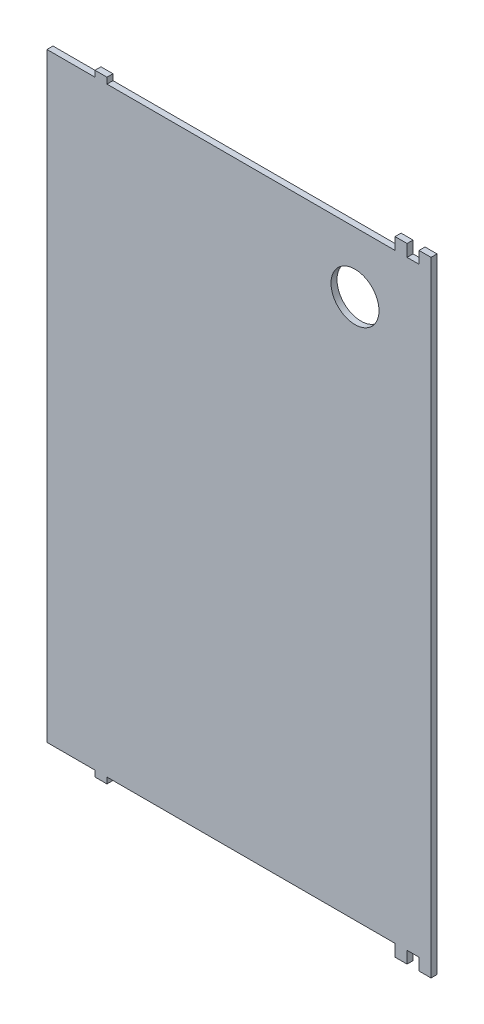
ISO-10303-21;
HEADER;
FILE_DESCRIPTION(('STEP AP214'),'2;1');
FILE_NAME('part.step','',(''),(''),'','','');
FILE_SCHEMA(('AUTOMOTIVE_DESIGN { 1 0 10303 214 1 1 1 1 }'));
ENDSEC;
DATA;
#1=APPLICATION_CONTEXT('core data for automotive mechanical design processes');
#2=APPLICATION_PROTOCOL_DEFINITION('international standard','automotive_design',2000,#1);
#3=PRODUCT_CONTEXT('',#1,'mechanical');
#4=PRODUCT('Part','Part','',(#3));
#5=PRODUCT_RELATED_PRODUCT_CATEGORY('part','',(#4));
#6=PRODUCT_DEFINITION_FORMATION('','',#4);
#7=PRODUCT_DEFINITION_CONTEXT('part definition',#1,'design');
#8=PRODUCT_DEFINITION('design','',#6,#7);
#9=PRODUCT_DEFINITION_SHAPE('','',#8);
#10=(LENGTH_UNIT() NAMED_UNIT(*) SI_UNIT(.MILLI.,.METRE.));
#11=(NAMED_UNIT(*) PLANE_ANGLE_UNIT() SI_UNIT($,.RADIAN.));
#12=(NAMED_UNIT(*) SI_UNIT($,.STERADIAN.) SOLID_ANGLE_UNIT());
#13=UNCERTAINTY_MEASURE_WITH_UNIT(LENGTH_MEASURE(1.E-05),#10,'distance_accuracy_value','');
#14=(GEOMETRIC_REPRESENTATION_CONTEXT(3) GLOBAL_UNCERTAINTY_ASSIGNED_CONTEXT((#13)) GLOBAL_UNIT_ASSIGNED_CONTEXT((#10,
#11,#12)) REPRESENTATION_CONTEXT('',''));
#15=CARTESIAN_POINT('',(0.,0.,0.));
#16=DIRECTION('',(0.,0.,1.));
#17=DIRECTION('',(1.,0.,0.));
#18=AXIS2_PLACEMENT_3D('',#15,#16,#17);
#19=CARTESIAN_POINT('',(0.,0.,2.));
#20=DIRECTION('',(0.,0.,1.));
#21=DIRECTION('',(1.,0.,0.));
#22=AXIS2_PLACEMENT_3D('',#19,#20,#21);
#23=PLANE('',#22);
#24=DIRECTION('',(0.,1.,0.));
#25=VECTOR('',#24,1.);
#26=CARTESIAN_POINT('',(43.6313588850174,146.890104529617,2.));
#27=LINE('',#26,#25);
#28=CARTESIAN_POINT('',(43.6313588850174,-57.1098954703833,2.));
#29=VERTEX_POINT('',#28);
#30=CARTESIAN_POINT('',(43.6313588850174,150.890104529617,2.));
#31=VERTEX_POINT('',#30);
#32=EDGE_CURVE('E52',#29,#31,#27,.T.);
#33=ORIENTED_EDGE('',*,*,#32,.T.);
#34=DIRECTION('',(-1.,0.,0.));
#35=VECTOR('',#34,1.);
#36=CARTESIAN_POINT('',(43.6313588850174,150.890104529617,2.));
#37=LINE('',#36,#35);
#38=CARTESIAN_POINT('',(39.6313588850174,150.890104529617,2.));
#39=VERTEX_POINT('',#38);
#40=EDGE_CURVE('E145',#31,#39,#37,.T.);
#41=ORIENTED_EDGE('',*,*,#40,.T.);
#42=DIRECTION('',(0.,-1.,0.));
#43=VECTOR('',#42,1.);
#44=CARTESIAN_POINT('',(39.6313588850174,150.890104529617,2.));
#45=LINE('',#44,#43);
#46=CARTESIAN_POINT('',(39.6313588850174,146.890104529617,2.));
#47=VERTEX_POINT('',#46);
#48=EDGE_CURVE('E343',#39,#47,#45,.T.);
#49=ORIENTED_EDGE('',*,*,#48,.T.);
#50=DIRECTION('',(-1.,0.,0.));
#51=VECTOR('',#50,1.);
#52=CARTESIAN_POINT('',(39.6313588850174,146.890104529617,2.));
#53=LINE('',#52,#51);
#54=CARTESIAN_POINT('',(35.6313588850173,146.890104529617,2.));
#55=VERTEX_POINT('',#54);
#56=EDGE_CURVE('E360',#47,#55,#53,.T.);
#57=ORIENTED_EDGE('',*,*,#56,.T.);
#58=DIRECTION('',(0.,1.,0.));
#59=VECTOR('',#58,1.);
#60=CARTESIAN_POINT('',(35.6313588850173,146.890104529617,2.));
#61=LINE('',#60,#59);
#62=CARTESIAN_POINT('',(35.6313588850173,150.890104529617,2.));
#63=VERTEX_POINT('',#62);
#64=EDGE_CURVE('E357',#55,#63,#61,.T.);
#65=ORIENTED_EDGE('',*,*,#64,.T.);
#66=DIRECTION('',(-1.,0.,0.));
#67=VECTOR('',#66,1.);
#68=CARTESIAN_POINT('',(35.6313588850173,150.890104529617,2.));
#69=LINE('',#68,#67);
#70=CARTESIAN_POINT('',(31.6313588850173,150.890104529617,2.));
#71=VERTEX_POINT('',#70);
#72=EDGE_CURVE('E359',#63,#71,#69,.T.);
#73=ORIENTED_EDGE('',*,*,#72,.T.);
#74=DIRECTION('',(0.,-1.,0.));
#75=VECTOR('',#74,1.);
#76=CARTESIAN_POINT('',(31.6313588850173,150.890104529617,2.));
#77=LINE('',#76,#75);
#78=CARTESIAN_POINT('',(31.6313588850173,146.890104529617,2.));
#79=VERTEX_POINT('',#78);
#80=EDGE_CURVE('E362',#71,#79,#77,.T.);
#81=ORIENTED_EDGE('',*,*,#80,.T.);
#82=DIRECTION('',(-1.,0.,0.));
#83=VECTOR('',#82,1.);
#84=CARTESIAN_POINT('',(-64.3686411149827,146.890104529617,2.));
#85=LINE('',#84,#83);
#86=CARTESIAN_POINT('',(-64.3686411149827,146.890104529617,2.));
#87=VERTEX_POINT('',#86);
#88=EDGE_CURVE('E368',#79,#87,#85,.T.);
#89=ORIENTED_EDGE('',*,*,#88,.T.);
#90=DIRECTION('',(0.,1.,0.));
#91=VECTOR('',#90,1.);
#92=CARTESIAN_POINT('',(-64.3686411149827,148.890104529617,2.));
#93=LINE('',#92,#91);
#94=CARTESIAN_POINT('',(-64.3686411149827,148.890104529617,2.));
#95=VERTEX_POINT('',#94);
#96=EDGE_CURVE('E370',#87,#95,#93,.T.);
#97=ORIENTED_EDGE('',*,*,#96,.T.);
#98=DIRECTION('',(-1.,0.,0.));
#99=VECTOR('',#98,1.);
#100=CARTESIAN_POINT('',(-66.3686411149827,148.890104529617,2.));
#101=LINE('',#100,#99);
#102=CARTESIAN_POINT('',(-68.3686411149827,148.890104529617,2.));
#103=VERTEX_POINT('',#102);
#104=EDGE_CURVE('E372',#95,#103,#101,.T.);
#105=ORIENTED_EDGE('',*,*,#104,.T.);
#106=DIRECTION('',(0.,-1.,0.));
#107=VECTOR('',#106,1.);
#108=CARTESIAN_POINT('',(-68.3686411149827,148.890104529617,2.));
#109=LINE('',#108,#107);
#110=CARTESIAN_POINT('',(-68.3686411149827,146.890104529617,2.));
#111=VERTEX_POINT('',#110);
#112=EDGE_CURVE('E374',#103,#111,#109,.T.);
#113=ORIENTED_EDGE('',*,*,#112,.T.);
#114=DIRECTION('',(-1.,0.,0.));
#115=VECTOR('',#114,1.);
#116=CARTESIAN_POINT('',(-68.3686411149827,146.890104529617,2.));
#117=LINE('',#116,#115);
#118=CARTESIAN_POINT('',(-84.3686411149826,146.890104529617,2.));
#119=VERTEX_POINT('',#118);
#120=EDGE_CURVE('E376',#111,#119,#117,.T.);
#121=ORIENTED_EDGE('',*,*,#120,.T.);
#122=DIRECTION('',(0.,-1.,0.));
#123=VECTOR('',#122,1.);
#124=CARTESIAN_POINT('',(-84.3686411149826,146.890104529617,2.));
#125=LINE('',#124,#123);
#126=CARTESIAN_POINT('',(-84.3686411149826,-53.1098954703833,2.));
#127=VERTEX_POINT('',#126);
#128=EDGE_CURVE('E378',#119,#127,#125,.T.);
#129=ORIENTED_EDGE('',*,*,#128,.T.);
#130=DIRECTION('',(1.,0.,0.));
#131=VECTOR('',#130,1.);
#132=CARTESIAN_POINT('',(-68.3686411149826,-53.1098954703833,2.));
#133=LINE('',#132,#131);
#134=CARTESIAN_POINT('',(-68.3686411149826,-53.1098954703833,2.));
#135=VERTEX_POINT('',#134);
#136=EDGE_CURVE('E380',#127,#135,#133,.T.);
#137=ORIENTED_EDGE('',*,*,#136,.T.);
#138=DIRECTION('',(0.,-1.,0.));
#139=VECTOR('',#138,1.);
#140=CARTESIAN_POINT('',(-68.3686411149826,-53.1098954703833,2.));
#141=LINE('',#140,#139);
#142=CARTESIAN_POINT('',(-68.3686411149826,-55.1098954703833,2.));
#143=VERTEX_POINT('',#142);
#144=EDGE_CURVE('E382',#135,#143,#141,.T.);
#145=ORIENTED_EDGE('',*,*,#144,.T.);
#146=DIRECTION('',(1.,0.,0.));
#147=VECTOR('',#146,1.);
#148=CARTESIAN_POINT('',(-66.3686411149826,-55.1098954703833,2.));
#149=LINE('',#148,#147);
#150=CARTESIAN_POINT('',(-64.3686411149826,-55.1098954703833,2.));
#151=VERTEX_POINT('',#150);
#152=EDGE_CURVE('E384',#143,#151,#149,.T.);
#153=ORIENTED_EDGE('',*,*,#152,.T.);
#154=DIRECTION('',(0.,1.,0.));
#155=VECTOR('',#154,1.);
#156=CARTESIAN_POINT('',(-64.3686411149826,-55.1098954703833,2.));
#157=LINE('',#156,#155);
#158=CARTESIAN_POINT('',(-64.3686411149826,-53.1098954703833,2.));
#159=VERTEX_POINT('',#158);
#160=EDGE_CURVE('E386',#151,#159,#157,.T.);
#161=ORIENTED_EDGE('',*,*,#160,.T.);
#162=DIRECTION('',(1.,0.,0.));
#163=VECTOR('',#162,1.);
#164=CARTESIAN_POINT('',(-64.3686411149826,-53.1098954703833,2.));
#165=LINE('',#164,#163);
#166=CARTESIAN_POINT('',(31.6313588850174,-53.1098954703833,2.));
#167=VERTEX_POINT('',#166);
#168=EDGE_CURVE('E388',#159,#167,#165,.T.);
#169=ORIENTED_EDGE('',*,*,#168,.T.);
#170=DIRECTION('',(0.,-1.,0.));
#171=VECTOR('',#170,1.);
#172=CARTESIAN_POINT('',(31.6313588850174,-57.1098954703833,2.));
#173=LINE('',#172,#171);
#174=CARTESIAN_POINT('',(31.6313588850174,-57.1098954703833,2.));
#175=VERTEX_POINT('',#174);
#176=EDGE_CURVE('E390',#167,#175,#173,.T.);
#177=ORIENTED_EDGE('',*,*,#176,.T.);
#178=DIRECTION('',(1.,0.,0.));
#179=VECTOR('',#178,1.);
#180=CARTESIAN_POINT('',(35.6313588850174,-57.1098954703833,2.));
#181=LINE('',#180,#179);
#182=CARTESIAN_POINT('',(35.6313588850174,-57.1098954703833,2.));
#183=VERTEX_POINT('',#182);
#184=EDGE_CURVE('E392',#175,#183,#181,.T.);
#185=ORIENTED_EDGE('',*,*,#184,.T.);
#186=DIRECTION('',(0.,1.,0.));
#187=VECTOR('',#186,1.);
#188=CARTESIAN_POINT('',(35.6313588850174,-53.1098954703833,2.));
#189=LINE('',#188,#187);
#190=CARTESIAN_POINT('',(35.6313588850174,-53.1098954703833,2.));
#191=VERTEX_POINT('',#190);
#192=EDGE_CURVE('E213',#183,#191,#189,.T.);
#193=ORIENTED_EDGE('',*,*,#192,.T.);
#194=DIRECTION('',(1.,0.,0.));
#195=VECTOR('',#194,1.);
#196=CARTESIAN_POINT('',(39.6313588850174,-53.1098954703833,2.));
#197=LINE('',#196,#195);
#198=CARTESIAN_POINT('',(39.6313588850174,-53.1098954703833,2.));
#199=VERTEX_POINT('',#198);
#200=EDGE_CURVE('E207',#191,#199,#197,.T.);
#201=ORIENTED_EDGE('',*,*,#200,.T.);
#202=DIRECTION('',(0.,-1.,0.));
#203=VECTOR('',#202,1.);
#204=CARTESIAN_POINT('',(39.6313588850174,-57.1098954703833,2.));
#205=LINE('',#204,#203);
#206=CARTESIAN_POINT('',(39.6313588850174,-57.1098954703833,2.));
#207=VERTEX_POINT('',#206);
#208=EDGE_CURVE('E211',#199,#207,#205,.T.);
#209=ORIENTED_EDGE('',*,*,#208,.T.);
#210=DIRECTION('',(1.,0.,0.));
#211=VECTOR('',#210,1.);
#212=CARTESIAN_POINT('',(43.6313588850174,-57.1098954703833,2.));
#213=LINE('',#212,#211);
#214=EDGE_CURVE('E227',#207,#29,#213,.T.);
#215=ORIENTED_EDGE('',*,*,#214,.T.);
#216=EDGE_LOOP('',(#33,#41,#49,#57,#65,#73,#81,#89,#97,#105,#113,#121,#129,#137,#145,#153,#161,
#169,#177,#185,#193,#201,#209,#215));
#217=FACE_BOUND('',#216,.T.);
#218=CARTESIAN_POINT('',(18.2891681924389,126.803401032248,2.));
#219=DIRECTION('',(0.,0.,1.));
#220=DIRECTION('',(1.,0.,0.));
#221=AXIS2_PLACEMENT_3D('',#218,#219,#220);
#222=CIRCLE('',#221,8.);
#223=CARTESIAN_POINT('',(26.2891681924389,126.803401032248,2.));
#224=VERTEX_POINT('',#223);
#225=EDGE_CURVE('E236',#224,#224,#222,.T.);
#226=ORIENTED_EDGE('',*,*,#225,.F.);
#227=EDGE_LOOP('',(#226));
#228=FACE_BOUND('',#227,.T.);
#229=ADVANCED_FACE('F35',(#217,#228),#23,.T.);
#230=CARTESIAN_POINT('',(0.,0.,0.));
#231=DIRECTION('',(0.,0.,1.));
#232=DIRECTION('',(1.,0.,0.));
#233=AXIS2_PLACEMENT_3D('',#230,#231,#232);
#234=PLANE('',#233);
#235=DIRECTION('',(-1.,0.,0.));
#236=VECTOR('',#235,1.);
#237=CARTESIAN_POINT('',(43.6313588850174,150.890104529617,0.));
#238=LINE('',#237,#236);
#239=CARTESIAN_POINT('',(43.6313588850174,150.890104529617,0.));
#240=VERTEX_POINT('',#239);
#241=CARTESIAN_POINT('',(39.6313588850174,150.890104529617,0.));
#242=VERTEX_POINT('',#241);
#243=EDGE_CURVE('E233',#240,#242,#238,.T.);
#244=ORIENTED_EDGE('',*,*,#243,.F.);
#245=DIRECTION('',(0.,1.,0.));
#246=VECTOR('',#245,1.);
#247=CARTESIAN_POINT('',(43.6313588850174,-53.1098954703833,0.));
#248=LINE('',#247,#246);
#249=CARTESIAN_POINT('',(43.6313588850174,-57.1098954703833,0.));
#250=VERTEX_POINT('',#249);
#251=EDGE_CURVE('E137',#250,#240,#248,.T.);
#252=ORIENTED_EDGE('',*,*,#251,.F.);
#253=DIRECTION('',(1.,0.,0.));
#254=VECTOR('',#253,1.);
#255=CARTESIAN_POINT('',(43.6313588850174,-57.1098954703833,0.));
#256=LINE('',#255,#254);
#257=CARTESIAN_POINT('',(39.6313588850174,-57.1098954703833,0.));
#258=VERTEX_POINT('',#257);
#259=EDGE_CURVE('E278',#258,#250,#256,.T.);
#260=ORIENTED_EDGE('',*,*,#259,.F.);
#261=DIRECTION('',(0.,-1.,0.));
#262=VECTOR('',#261,1.);
#263=CARTESIAN_POINT('',(39.6313588850174,-57.1098954703833,0.));
#264=LINE('',#263,#262);
#265=CARTESIAN_POINT('',(39.6313588850174,-53.1098954703833,0.));
#266=VERTEX_POINT('',#265);
#267=EDGE_CURVE('E130',#266,#258,#264,.T.);
#268=ORIENTED_EDGE('',*,*,#267,.F.);
#269=DIRECTION('',(1.,0.,0.));
#270=VECTOR('',#269,1.);
#271=CARTESIAN_POINT('',(39.6313588850174,-53.1098954703833,0.));
#272=LINE('',#271,#270);
#273=CARTESIAN_POINT('',(35.6313588850174,-53.1098954703833,0.));
#274=VERTEX_POINT('',#273);
#275=EDGE_CURVE('E221',#274,#266,#272,.T.);
#276=ORIENTED_EDGE('',*,*,#275,.F.);
#277=DIRECTION('',(0.,1.,0.));
#278=VECTOR('',#277,1.);
#279=CARTESIAN_POINT('',(35.6313588850174,-53.1098954703833,0.));
#280=LINE('',#279,#278);
#281=CARTESIAN_POINT('',(35.6313588850174,-57.1098954703833,0.));
#282=VERTEX_POINT('',#281);
#283=EDGE_CURVE('E274',#282,#274,#280,.T.);
#284=ORIENTED_EDGE('',*,*,#283,.F.);
#285=DIRECTION('',(1.,0.,0.));
#286=VECTOR('',#285,1.);
#287=CARTESIAN_POINT('',(35.6313588850174,-57.1098954703833,0.));
#288=LINE('',#287,#286);
#289=CARTESIAN_POINT('',(31.6313588850174,-57.1098954703833,0.));
#290=VERTEX_POINT('',#289);
#291=EDGE_CURVE('E272',#290,#282,#288,.T.);
#292=ORIENTED_EDGE('',*,*,#291,.F.);
#293=DIRECTION('',(0.,-1.,0.));
#294=VECTOR('',#293,1.);
#295=CARTESIAN_POINT('',(31.6313588850174,-57.1098954703833,0.));
#296=LINE('',#295,#294);
#297=CARTESIAN_POINT('',(31.6313588850174,-53.1098954703833,0.));
#298=VERTEX_POINT('',#297);
#299=EDGE_CURVE('E270',#298,#290,#296,.T.);
#300=ORIENTED_EDGE('',*,*,#299,.F.);
#301=DIRECTION('',(1.,0.,0.));
#302=VECTOR('',#301,1.);
#303=CARTESIAN_POINT('',(-64.3686411149826,-53.1098954703833,0.));
#304=LINE('',#303,#302);
#305=CARTESIAN_POINT('',(-64.3686411149826,-53.1098954703833,0.));
#306=VERTEX_POINT('',#305);
#307=EDGE_CURVE('E268',#306,#298,#304,.T.);
#308=ORIENTED_EDGE('',*,*,#307,.F.);
#309=DIRECTION('',(0.,1.,0.));
#310=VECTOR('',#309,1.);
#311=CARTESIAN_POINT('',(-64.3686411149826,-55.1098954703833,0.));
#312=LINE('',#311,#310);
#313=CARTESIAN_POINT('',(-64.3686411149826,-55.1098954703833,0.));
#314=VERTEX_POINT('',#313);
#315=EDGE_CURVE('E266',#314,#306,#312,.T.);
#316=ORIENTED_EDGE('',*,*,#315,.F.);
#317=DIRECTION('',(1.,0.,0.));
#318=VECTOR('',#317,1.);
#319=CARTESIAN_POINT('',(-66.3686411149826,-55.1098954703833,0.));
#320=LINE('',#319,#318);
#321=CARTESIAN_POINT('',(-68.3686411149826,-55.1098954703833,0.));
#322=VERTEX_POINT('',#321);
#323=EDGE_CURVE('E264',#322,#314,#320,.T.);
#324=ORIENTED_EDGE('',*,*,#323,.F.);
#325=DIRECTION('',(0.,-1.,0.));
#326=VECTOR('',#325,1.);
#327=CARTESIAN_POINT('',(-68.3686411149826,-53.1098954703833,0.));
#328=LINE('',#327,#326);
#329=CARTESIAN_POINT('',(-68.3686411149826,-53.1098954703833,0.));
#330=VERTEX_POINT('',#329);
#331=EDGE_CURVE('E261',#330,#322,#328,.T.);
#332=ORIENTED_EDGE('',*,*,#331,.F.);
#333=DIRECTION('',(1.,0.,0.));
#334=VECTOR('',#333,1.);
#335=CARTESIAN_POINT('',(-68.3686411149826,-53.1098954703833,0.));
#336=LINE('',#335,#334);
#337=CARTESIAN_POINT('',(-84.3686411149826,-53.1098954703833,0.));
#338=VERTEX_POINT('',#337);
#339=EDGE_CURVE('E259',#338,#330,#336,.T.);
#340=ORIENTED_EDGE('',*,*,#339,.F.);
#341=DIRECTION('',(0.,-1.,0.));
#342=VECTOR('',#341,1.);
#343=CARTESIAN_POINT('',(-84.3686411149826,146.890104529617,0.));
#344=LINE('',#343,#342);
#345=CARTESIAN_POINT('',(-84.3686411149826,146.890104529617,0.));
#346=VERTEX_POINT('',#345);
#347=EDGE_CURVE('E257',#346,#338,#344,.T.);
#348=ORIENTED_EDGE('',*,*,#347,.F.);
#349=DIRECTION('',(-1.,0.,0.));
#350=VECTOR('',#349,1.);
#351=CARTESIAN_POINT('',(-68.3686411149827,146.890104529617,0.));
#352=LINE('',#351,#350);
#353=CARTESIAN_POINT('',(-68.3686411149827,146.890104529617,0.));
#354=VERTEX_POINT('',#353);
#355=EDGE_CURVE('E255',#354,#346,#352,.T.);
#356=ORIENTED_EDGE('',*,*,#355,.F.);
#357=DIRECTION('',(0.,-1.,0.));
#358=VECTOR('',#357,1.);
#359=CARTESIAN_POINT('',(-68.3686411149827,148.890104529617,0.));
#360=LINE('',#359,#358);
#361=CARTESIAN_POINT('',(-68.3686411149827,148.890104529617,0.));
#362=VERTEX_POINT('',#361);
#363=EDGE_CURVE('E253',#362,#354,#360,.T.);
#364=ORIENTED_EDGE('',*,*,#363,.F.);
#365=DIRECTION('',(-1.,0.,0.));
#366=VECTOR('',#365,1.);
#367=CARTESIAN_POINT('',(-66.3686411149827,148.890104529617,0.));
#368=LINE('',#367,#366);
#369=CARTESIAN_POINT('',(-64.3686411149827,148.890104529617,0.));
#370=VERTEX_POINT('',#369);
#371=EDGE_CURVE('E251',#370,#362,#368,.T.);
#372=ORIENTED_EDGE('',*,*,#371,.F.);
#373=DIRECTION('',(0.,1.,0.));
#374=VECTOR('',#373,1.);
#375=CARTESIAN_POINT('',(-64.3686411149827,148.890104529617,0.));
#376=LINE('',#375,#374);
#377=CARTESIAN_POINT('',(-64.3686411149827,146.890104529617,0.));
#378=VERTEX_POINT('',#377);
#379=EDGE_CURVE('E248',#378,#370,#376,.T.);
#380=ORIENTED_EDGE('',*,*,#379,.F.);
#381=DIRECTION('',(-1.,0.,0.));
#382=VECTOR('',#381,1.);
#383=CARTESIAN_POINT('',(-64.3686411149827,146.890104529617,0.));
#384=LINE('',#383,#382);
#385=CARTESIAN_POINT('',(31.6313588850173,146.890104529617,0.));
#386=VERTEX_POINT('',#385);
#387=EDGE_CURVE('E246',#386,#378,#384,.T.);
#388=ORIENTED_EDGE('',*,*,#387,.F.);
#389=DIRECTION('',(0.,-1.,0.));
#390=VECTOR('',#389,1.);
#391=CARTESIAN_POINT('',(31.6313588850173,150.890104529617,0.));
#392=LINE('',#391,#390);
#393=CARTESIAN_POINT('',(31.6313588850173,150.890104529617,0.));
#394=VERTEX_POINT('',#393);
#395=EDGE_CURVE('E244',#394,#386,#392,.T.);
#396=ORIENTED_EDGE('',*,*,#395,.F.);
#397=DIRECTION('',(-1.,0.,0.));
#398=VECTOR('',#397,1.);
#399=CARTESIAN_POINT('',(35.6313588850173,150.890104529617,0.));
#400=LINE('',#399,#398);
#401=CARTESIAN_POINT('',(35.6313588850173,150.890104529617,0.));
#402=VERTEX_POINT('',#401);
#403=EDGE_CURVE('E242',#402,#394,#400,.T.);
#404=ORIENTED_EDGE('',*,*,#403,.F.);
#405=DIRECTION('',(0.,1.,0.));
#406=VECTOR('',#405,1.);
#407=CARTESIAN_POINT('',(35.6313588850173,146.890104529617,0.));
#408=LINE('',#407,#406);
#409=CARTESIAN_POINT('',(35.6313588850173,146.890104529617,0.));
#410=VERTEX_POINT('',#409);
#411=EDGE_CURVE('E240',#410,#402,#408,.T.);
#412=ORIENTED_EDGE('',*,*,#411,.F.);
#413=DIRECTION('',(-1.,0.,0.));
#414=VECTOR('',#413,1.);
#415=CARTESIAN_POINT('',(39.6313588850174,146.890104529617,0.));
#416=LINE('',#415,#414);
#417=CARTESIAN_POINT('',(39.6313588850174,146.890104529617,0.));
#418=VERTEX_POINT('',#417);
#419=EDGE_CURVE('E238',#418,#410,#416,.T.);
#420=ORIENTED_EDGE('',*,*,#419,.F.);
#421=DIRECTION('',(0.,-1.,0.));
#422=VECTOR('',#421,1.);
#423=CARTESIAN_POINT('',(39.6313588850174,150.890104529617,0.));
#424=LINE('',#423,#422);
#425=EDGE_CURVE('E235',#242,#418,#424,.T.);
#426=ORIENTED_EDGE('',*,*,#425,.F.);
#427=EDGE_LOOP('',(#244,#252,#260,#268,#276,#284,#292,#300,#308,#316,#324,#332,#340,#348,#356,
#364,#372,#380,#388,#396,#404,#412,#420,#426));
#428=FACE_BOUND('',#427,.T.);
#429=CARTESIAN_POINT('',(18.2891681924389,126.803401032248,0.));
#430=DIRECTION('',(0.,0.,1.));
#431=DIRECTION('',(1.,0.,0.));
#432=AXIS2_PLACEMENT_3D('',#429,#430,#431);
#433=CIRCLE('',#432,8.);
#434=CARTESIAN_POINT('',(26.2891681924389,126.803401032248,0.));
#435=VERTEX_POINT('',#434);
#436=EDGE_CURVE('E668',#435,#435,#433,.T.);
#437=ORIENTED_EDGE('',*,*,#436,.T.);
#438=EDGE_LOOP('',(#437));
#439=FACE_BOUND('',#438,.T.);
#440=ADVANCED_FACE('F345',(#428,#439),#234,.F.);
#441=CARTESIAN_POINT('',(43.6313588850174,150.890104529617,2.));
#442=DIRECTION('',(0.,-1.,0.));
#443=DIRECTION('',(0.,0.,-1.));
#444=AXIS2_PLACEMENT_3D('',#441,#442,#443);
#445=PLANE('',#444);
#446=ORIENTED_EDGE('',*,*,#243,.T.);
#447=DIRECTION('',(0.,0.,-1.));
#448=VECTOR('',#447,1.);
#449=CARTESIAN_POINT('',(39.6313588850174,150.890104529617,2.));
#450=LINE('',#449,#448);
#451=EDGE_CURVE('E44',#39,#242,#450,.T.);
#452=ORIENTED_EDGE('',*,*,#451,.F.);
#453=ORIENTED_EDGE('',*,*,#40,.F.);
#454=DIRECTION('',(0.,0.,-1.));
#455=VECTOR('',#454,1.);
#456=CARTESIAN_POINT('',(43.6313588850174,150.890104529617,2.));
#457=LINE('',#456,#455);
#458=EDGE_CURVE('E11',#31,#240,#457,.T.);
#459=ORIENTED_EDGE('',*,*,#458,.T.);
#460=EDGE_LOOP('',(#446,#452,#453,#459));
#461=FACE_BOUND('',#460,.T.);
#462=ADVANCED_FACE('F37',(#461),#445,.F.);
#463=CARTESIAN_POINT('',(39.6313588850174,150.890104529617,2.));
#464=DIRECTION('',(1.,0.,0.));
#465=DIRECTION('',(0.,0.,-1.));
#466=AXIS2_PLACEMENT_3D('',#463,#464,#465);
#467=PLANE('',#466);
#468=ORIENTED_EDGE('',*,*,#425,.T.);
#469=DIRECTION('',(0.,0.,-1.));
#470=VECTOR('',#469,1.);
#471=CARTESIAN_POINT('',(39.6313588850174,146.890104529617,2.));
#472=LINE('',#471,#470);
#473=EDGE_CURVE('E335',#47,#418,#472,.T.);
#474=ORIENTED_EDGE('',*,*,#473,.F.);
#475=ORIENTED_EDGE('',*,*,#48,.F.);
#476=ORIENTED_EDGE('',*,*,#451,.T.);
#477=EDGE_LOOP('',(#468,#474,#475,#476));
#478=FACE_BOUND('',#477,.T.);
#479=ADVANCED_FACE('F341',(#478),#467,.F.);
#480=CARTESIAN_POINT('',(39.6313588850174,146.890104529617,2.));
#481=DIRECTION('',(0.,-1.,0.));
#482=DIRECTION('',(0.,0.,-1.));
#483=AXIS2_PLACEMENT_3D('',#480,#481,#482);
#484=PLANE('',#483);
#485=ORIENTED_EDGE('',*,*,#419,.T.);
#486=DIRECTION('',(0.,0.,-1.));
#487=VECTOR('',#486,1.);
#488=CARTESIAN_POINT('',(35.6313588850173,146.890104529617,2.));
#489=LINE('',#488,#487);
#490=EDGE_CURVE('E332',#55,#410,#489,.T.);
#491=ORIENTED_EDGE('',*,*,#490,.F.);
#492=ORIENTED_EDGE('',*,*,#56,.F.);
#493=ORIENTED_EDGE('',*,*,#473,.T.);
#494=EDGE_LOOP('',(#485,#491,#492,#493));
#495=FACE_BOUND('',#494,.T.);
#496=ADVANCED_FACE('F351',(#495),#484,.F.);
#497=CARTESIAN_POINT('',(35.6313588850173,146.890104529617,2.));
#498=DIRECTION('',(-1.,0.,0.));
#499=DIRECTION('',(0.,0.,1.));
#500=AXIS2_PLACEMENT_3D('',#497,#498,#499);
#501=PLANE('',#500);
#502=ORIENTED_EDGE('',*,*,#411,.T.);
#503=DIRECTION('',(0.,0.,-1.));
#504=VECTOR('',#503,1.);
#505=CARTESIAN_POINT('',(35.6313588850173,150.890104529617,2.));
#506=LINE('',#505,#504);
#507=EDGE_CURVE('E329',#63,#402,#506,.T.);
#508=ORIENTED_EDGE('',*,*,#507,.F.);
#509=ORIENTED_EDGE('',*,*,#64,.F.);
#510=ORIENTED_EDGE('',*,*,#490,.T.);
#511=EDGE_LOOP('',(#502,#508,#509,#510));
#512=FACE_BOUND('',#511,.T.);
#513=ADVANCED_FACE('F355',(#512),#501,.F.);
#514=CARTESIAN_POINT('',(35.6313588850173,150.890104529617,2.));
#515=DIRECTION('',(0.,-1.,0.));
#516=DIRECTION('',(0.,0.,-1.));
#517=AXIS2_PLACEMENT_3D('',#514,#515,#516);
#518=PLANE('',#517);
#519=ORIENTED_EDGE('',*,*,#403,.T.);
#520=DIRECTION('',(0.,0.,-1.));
#521=VECTOR('',#520,1.);
#522=CARTESIAN_POINT('',(31.6313588850173,150.890104529617,2.));
#523=LINE('',#522,#521);
#524=EDGE_CURVE('E326',#71,#394,#523,.T.);
#525=ORIENTED_EDGE('',*,*,#524,.F.);
#526=ORIENTED_EDGE('',*,*,#72,.F.);
#527=ORIENTED_EDGE('',*,*,#507,.T.);
#528=EDGE_LOOP('',(#519,#525,#526,#527));
#529=FACE_BOUND('',#528,.T.);
#530=ADVANCED_FACE('F483',(#529),#518,.F.);
#531=CARTESIAN_POINT('',(31.6313588850173,150.890104529617,2.));
#532=DIRECTION('',(1.,0.,0.));
#533=DIRECTION('',(0.,0.,-1.));
#534=AXIS2_PLACEMENT_3D('',#531,#532,#533);
#535=PLANE('',#534);
#536=ORIENTED_EDGE('',*,*,#395,.T.);
#537=DIRECTION('',(0.,0.,-1.));
#538=VECTOR('',#537,1.);
#539=CARTESIAN_POINT('',(31.6313588850173,146.890104529617,2.));
#540=LINE('',#539,#538);
#541=EDGE_CURVE('E323',#79,#386,#540,.T.);
#542=ORIENTED_EDGE('',*,*,#541,.F.);
#543=ORIENTED_EDGE('',*,*,#80,.F.);
#544=ORIENTED_EDGE('',*,*,#524,.T.);
#545=EDGE_LOOP('',(#536,#542,#543,#544));
#546=FACE_BOUND('',#545,.T.);
#547=ADVANCED_FACE('F479',(#546),#535,.F.);
#548=CARTESIAN_POINT('',(-64.3686411149827,146.890104529617,2.));
#549=DIRECTION('',(0.,-1.,0.));
#550=DIRECTION('',(1.,0.,0.));
#551=AXIS2_PLACEMENT_3D('',#548,#549,#550);
#552=PLANE('',#551);
#553=ORIENTED_EDGE('',*,*,#387,.T.);
#554=DIRECTION('',(0.,0.,-1.));
#555=VECTOR('',#554,1.);
#556=CARTESIAN_POINT('',(-64.3686411149827,146.890104529617,2.));
#557=LINE('',#556,#555);
#558=EDGE_CURVE('E320',#87,#378,#557,.T.);
#559=ORIENTED_EDGE('',*,*,#558,.F.);
#560=ORIENTED_EDGE('',*,*,#88,.F.);
#561=ORIENTED_EDGE('',*,*,#541,.T.);
#562=EDGE_LOOP('',(#553,#559,#560,#561));
#563=FACE_BOUND('',#562,.T.);
#564=ADVANCED_FACE('F475',(#563),#552,.F.);
#565=CARTESIAN_POINT('',(-64.3686411149827,148.890104529617,2.));
#566=DIRECTION('',(-1.,0.,0.));
#567=DIRECTION('',(0.,0.,1.));
#568=AXIS2_PLACEMENT_3D('',#565,#566,#567);
#569=PLANE('',#568);
#570=ORIENTED_EDGE('',*,*,#379,.T.);
#571=DIRECTION('',(0.,0.,-1.));
#572=VECTOR('',#571,1.);
#573=CARTESIAN_POINT('',(-64.3686411149827,148.890104529617,2.));
#574=LINE('',#573,#572);
#575=EDGE_CURVE('E317',#95,#370,#574,.T.);
#576=ORIENTED_EDGE('',*,*,#575,.F.);
#577=ORIENTED_EDGE('',*,*,#96,.F.);
#578=ORIENTED_EDGE('',*,*,#558,.T.);
#579=EDGE_LOOP('',(#570,#576,#577,#578));
#580=FACE_BOUND('',#579,.T.);
#581=ADVANCED_FACE('F471',(#580),#569,.F.);
#582=CARTESIAN_POINT('',(-66.3686411149827,148.890104529617,2.));
#583=DIRECTION('',(0.,-1.,0.));
#584=DIRECTION('',(0.,0.,-1.));
#585=AXIS2_PLACEMENT_3D('',#582,#583,#584);
#586=PLANE('',#585);
#587=ORIENTED_EDGE('',*,*,#371,.T.);
#588=DIRECTION('',(0.,0.,-1.));
#589=VECTOR('',#588,1.);
#590=CARTESIAN_POINT('',(-68.3686411149827,148.890104529617,2.));
#591=LINE('',#590,#589);
#592=EDGE_CURVE('E314',#103,#362,#591,.T.);
#593=ORIENTED_EDGE('',*,*,#592,.F.);
#594=ORIENTED_EDGE('',*,*,#104,.F.);
#595=ORIENTED_EDGE('',*,*,#575,.T.);
#596=EDGE_LOOP('',(#587,#593,#594,#595));
#597=FACE_BOUND('',#596,.T.);
#598=ADVANCED_FACE('F467',(#597),#586,.F.);
#599=CARTESIAN_POINT('',(-68.3686411149827,148.890104529617,2.));
#600=DIRECTION('',(1.,0.,0.));
#601=DIRECTION('',(0.,0.,-1.));
#602=AXIS2_PLACEMENT_3D('',#599,#600,#601);
#603=PLANE('',#602);
#604=ORIENTED_EDGE('',*,*,#363,.T.);
#605=DIRECTION('',(0.,0.,-1.));
#606=VECTOR('',#605,1.);
#607=CARTESIAN_POINT('',(-68.3686411149827,146.890104529617,2.));
#608=LINE('',#607,#606);
#609=EDGE_CURVE('E311',#111,#354,#608,.T.);
#610=ORIENTED_EDGE('',*,*,#609,.F.);
#611=ORIENTED_EDGE('',*,*,#112,.F.);
#612=ORIENTED_EDGE('',*,*,#592,.T.);
#613=EDGE_LOOP('',(#604,#610,#611,#612));
#614=FACE_BOUND('',#613,.T.);
#615=ADVANCED_FACE('F463',(#614),#603,.F.);
#616=CARTESIAN_POINT('',(-68.3686411149827,146.890104529617,2.));
#617=DIRECTION('',(0.,-1.,0.));
#618=DIRECTION('',(1.,0.,0.));
#619=AXIS2_PLACEMENT_3D('',#616,#617,#618);
#620=PLANE('',#619);
#621=ORIENTED_EDGE('',*,*,#355,.T.);
#622=DIRECTION('',(0.,0.,-1.));
#623=VECTOR('',#622,1.);
#624=CARTESIAN_POINT('',(-84.3686411149826,146.890104529617,2.));
#625=LINE('',#624,#623);
#626=EDGE_CURVE('E308',#119,#346,#625,.T.);
#627=ORIENTED_EDGE('',*,*,#626,.F.);
#628=ORIENTED_EDGE('',*,*,#120,.F.);
#629=ORIENTED_EDGE('',*,*,#609,.T.);
#630=EDGE_LOOP('',(#621,#627,#628,#629));
#631=FACE_BOUND('',#630,.T.);
#632=ADVANCED_FACE('F459',(#631),#620,.F.);
#633=CARTESIAN_POINT('',(-84.3686411149826,146.890104529617,2.));
#634=DIRECTION('',(1.,0.,0.));
#635=DIRECTION('',(0.,1.,0.));
#636=AXIS2_PLACEMENT_3D('',#633,#634,#635);
#637=PLANE('',#636);
#638=ORIENTED_EDGE('',*,*,#347,.T.);
#639=DIRECTION('',(0.,0.,-1.));
#640=VECTOR('',#639,1.);
#641=CARTESIAN_POINT('',(-84.3686411149826,-53.1098954703833,2.));
#642=LINE('',#641,#640);
#643=EDGE_CURVE('E305',#127,#338,#642,.T.);
#644=ORIENTED_EDGE('',*,*,#643,.F.);
#645=ORIENTED_EDGE('',*,*,#128,.F.);
#646=ORIENTED_EDGE('',*,*,#626,.T.);
#647=EDGE_LOOP('',(#638,#644,#645,#646));
#648=FACE_BOUND('',#647,.T.);
#649=ADVANCED_FACE('F455',(#648),#637,.F.);
#650=CARTESIAN_POINT('',(-68.3686411149826,-53.1098954703833,2.));
#651=DIRECTION('',(0.,1.,0.));
#652=DIRECTION('',(-1.,0.,0.));
#653=AXIS2_PLACEMENT_3D('',#650,#651,#652);
#654=PLANE('',#653);
#655=ORIENTED_EDGE('',*,*,#339,.T.);
#656=DIRECTION('',(0.,0.,-1.));
#657=VECTOR('',#656,1.);
#658=CARTESIAN_POINT('',(-68.3686411149826,-53.1098954703833,2.));
#659=LINE('',#658,#657);
#660=EDGE_CURVE('E302',#135,#330,#659,.T.);
#661=ORIENTED_EDGE('',*,*,#660,.F.);
#662=ORIENTED_EDGE('',*,*,#136,.F.);
#663=ORIENTED_EDGE('',*,*,#643,.T.);
#664=EDGE_LOOP('',(#655,#661,#662,#663));
#665=FACE_BOUND('',#664,.T.);
#666=ADVANCED_FACE('F451',(#665),#654,.F.);
#667=CARTESIAN_POINT('',(-68.3686411149826,-53.1098954703833,2.));
#668=DIRECTION('',(1.,0.,0.));
#669=DIRECTION('',(0.,0.,-1.));
#670=AXIS2_PLACEMENT_3D('',#667,#668,#669);
#671=PLANE('',#670);
#672=ORIENTED_EDGE('',*,*,#331,.T.);
#673=DIRECTION('',(0.,0.,-1.));
#674=VECTOR('',#673,1.);
#675=CARTESIAN_POINT('',(-68.3686411149826,-55.1098954703833,2.));
#676=LINE('',#675,#674);
#677=EDGE_CURVE('E299',#143,#322,#676,.T.);
#678=ORIENTED_EDGE('',*,*,#677,.F.);
#679=ORIENTED_EDGE('',*,*,#144,.F.);
#680=ORIENTED_EDGE('',*,*,#660,.T.);
#681=EDGE_LOOP('',(#672,#678,#679,#680));
#682=FACE_BOUND('',#681,.T.);
#683=ADVANCED_FACE('F447',(#682),#671,.F.);
#684=CARTESIAN_POINT('',(-66.3686411149826,-55.1098954703833,2.));
#685=DIRECTION('',(0.,1.,0.));
#686=DIRECTION('',(0.,0.,1.));
#687=AXIS2_PLACEMENT_3D('',#684,#685,#686);
#688=PLANE('',#687);
#689=ORIENTED_EDGE('',*,*,#323,.T.);
#690=DIRECTION('',(0.,0.,-1.));
#691=VECTOR('',#690,1.);
#692=CARTESIAN_POINT('',(-64.3686411149826,-55.1098954703833,2.));
#693=LINE('',#692,#691);
#694=EDGE_CURVE('E296',#151,#314,#693,.T.);
#695=ORIENTED_EDGE('',*,*,#694,.F.);
#696=ORIENTED_EDGE('',*,*,#152,.F.);
#697=ORIENTED_EDGE('',*,*,#677,.T.);
#698=EDGE_LOOP('',(#689,#695,#696,#697));
#699=FACE_BOUND('',#698,.T.);
#700=ADVANCED_FACE('F443',(#699),#688,.F.);
#701=CARTESIAN_POINT('',(-64.3686411149826,-55.1098954703833,2.));
#702=DIRECTION('',(-1.,0.,0.));
#703=DIRECTION('',(0.,0.,1.));
#704=AXIS2_PLACEMENT_3D('',#701,#702,#703);
#705=PLANE('',#704);
#706=ORIENTED_EDGE('',*,*,#315,.T.);
#707=DIRECTION('',(0.,0.,-1.));
#708=VECTOR('',#707,1.);
#709=CARTESIAN_POINT('',(-64.3686411149826,-53.1098954703833,2.));
#710=LINE('',#709,#708);
#711=EDGE_CURVE('E293',#159,#306,#710,.T.);
#712=ORIENTED_EDGE('',*,*,#711,.F.);
#713=ORIENTED_EDGE('',*,*,#160,.F.);
#714=ORIENTED_EDGE('',*,*,#694,.T.);
#715=EDGE_LOOP('',(#706,#712,#713,#714));
#716=FACE_BOUND('',#715,.T.);
#717=ADVANCED_FACE('F439',(#716),#705,.F.);
#718=CARTESIAN_POINT('',(-64.3686411149826,-53.1098954703833,2.));
#719=DIRECTION('',(0.,1.,0.));
#720=DIRECTION('',(-1.,0.,0.));
#721=AXIS2_PLACEMENT_3D('',#718,#719,#720);
#722=PLANE('',#721);
#723=ORIENTED_EDGE('',*,*,#307,.T.);
#724=DIRECTION('',(0.,0.,-1.));
#725=VECTOR('',#724,1.);
#726=CARTESIAN_POINT('',(31.6313588850174,-53.1098954703833,2.));
#727=LINE('',#726,#725);
#728=EDGE_CURVE('E290',#167,#298,#727,.T.);
#729=ORIENTED_EDGE('',*,*,#728,.F.);
#730=ORIENTED_EDGE('',*,*,#168,.F.);
#731=ORIENTED_EDGE('',*,*,#711,.T.);
#732=EDGE_LOOP('',(#723,#729,#730,#731));
#733=FACE_BOUND('',#732,.T.);
#734=ADVANCED_FACE('F435',(#733),#722,.F.);
#735=CARTESIAN_POINT('',(31.6313588850174,-57.1098954703833,2.));
#736=DIRECTION('',(1.,0.,0.));
#737=DIRECTION('',(0.,0.,-1.));
#738=AXIS2_PLACEMENT_3D('',#735,#736,#737);
#739=PLANE('',#738);
#740=ORIENTED_EDGE('',*,*,#299,.T.);
#741=DIRECTION('',(0.,0.,-1.));
#742=VECTOR('',#741,1.);
#743=CARTESIAN_POINT('',(31.6313588850174,-57.1098954703833,2.));
#744=LINE('',#743,#742);
#745=EDGE_CURVE('E287',#175,#290,#744,.T.);
#746=ORIENTED_EDGE('',*,*,#745,.F.);
#747=ORIENTED_EDGE('',*,*,#176,.F.);
#748=ORIENTED_EDGE('',*,*,#728,.T.);
#749=EDGE_LOOP('',(#740,#746,#747,#748));
#750=FACE_BOUND('',#749,.T.);
#751=ADVANCED_FACE('F432',(#750),#739,.F.);
#752=CARTESIAN_POINT('',(35.6313588850174,-57.1098954703833,2.));
#753=DIRECTION('',(0.,1.,0.));
#754=DIRECTION('',(0.,0.,1.));
#755=AXIS2_PLACEMENT_3D('',#752,#753,#754);
#756=PLANE('',#755);
#757=ORIENTED_EDGE('',*,*,#291,.T.);
#758=DIRECTION('',(0.,0.,-1.));
#759=VECTOR('',#758,1.);
#760=CARTESIAN_POINT('',(35.6313588850174,-57.1098954703833,2.));
#761=LINE('',#760,#759);
#762=EDGE_CURVE('E284',#183,#282,#761,.T.);
#763=ORIENTED_EDGE('',*,*,#762,.F.);
#764=ORIENTED_EDGE('',*,*,#184,.F.);
#765=ORIENTED_EDGE('',*,*,#745,.T.);
#766=EDGE_LOOP('',(#757,#763,#764,#765));
#767=FACE_BOUND('',#766,.T.);
#768=ADVANCED_FACE('F398',(#767),#756,.F.);
#769=CARTESIAN_POINT('',(35.6313588850174,-53.1098954703833,2.));
#770=DIRECTION('',(-1.,0.,0.));
#771=DIRECTION('',(0.,0.,1.));
#772=AXIS2_PLACEMENT_3D('',#769,#770,#771);
#773=PLANE('',#772);
#774=ORIENTED_EDGE('',*,*,#283,.T.);
#775=DIRECTION('',(0.,0.,-1.));
#776=VECTOR('',#775,1.);
#777=CARTESIAN_POINT('',(35.6313588850174,-53.1098954703833,2.));
#778=LINE('',#777,#776);
#779=EDGE_CURVE('E222',#191,#274,#778,.T.);
#780=ORIENTED_EDGE('',*,*,#779,.F.);
#781=ORIENTED_EDGE('',*,*,#192,.F.);
#782=ORIENTED_EDGE('',*,*,#762,.T.);
#783=EDGE_LOOP('',(#774,#780,#781,#782));
#784=FACE_BOUND('',#783,.T.);
#785=ADVANCED_FACE('F402',(#784),#773,.F.);
#786=CARTESIAN_POINT('',(39.6313588850174,-53.1098954703833,2.));
#787=DIRECTION('',(0.,1.,0.));
#788=DIRECTION('',(0.,0.,1.));
#789=AXIS2_PLACEMENT_3D('',#786,#787,#788);
#790=PLANE('',#789);
#791=ORIENTED_EDGE('',*,*,#275,.T.);
#792=DIRECTION('',(0.,0.,-1.));
#793=VECTOR('',#792,1.);
#794=CARTESIAN_POINT('',(39.6313588850174,-53.1098954703833,2.));
#795=LINE('',#794,#793);
#796=EDGE_CURVE('E218',#199,#266,#795,.T.);
#797=ORIENTED_EDGE('',*,*,#796,.F.);
#798=ORIENTED_EDGE('',*,*,#200,.F.);
#799=ORIENTED_EDGE('',*,*,#779,.T.);
#800=EDGE_LOOP('',(#791,#797,#798,#799));
#801=FACE_BOUND('',#800,.T.);
#802=ADVANCED_FACE('F219',(#801),#790,.F.);
#803=CARTESIAN_POINT('',(39.6313588850174,-57.1098954703833,2.));
#804=DIRECTION('',(1.,0.,0.));
#805=DIRECTION('',(0.,0.,-1.));
#806=AXIS2_PLACEMENT_3D('',#803,#804,#805);
#807=PLANE('',#806);
#808=ORIENTED_EDGE('',*,*,#267,.T.);
#809=DIRECTION('',(0.,0.,-1.));
#810=VECTOR('',#809,1.);
#811=CARTESIAN_POINT('',(39.6313588850174,-57.1098954703833,2.));
#812=LINE('',#811,#810);
#813=EDGE_CURVE('E223',#207,#258,#812,.T.);
#814=ORIENTED_EDGE('',*,*,#813,.F.);
#815=ORIENTED_EDGE('',*,*,#208,.F.);
#816=ORIENTED_EDGE('',*,*,#796,.T.);
#817=EDGE_LOOP('',(#808,#814,#815,#816));
#818=FACE_BOUND('',#817,.T.);
#819=ADVANCED_FACE('F225',(#818),#807,.F.);
#820=CARTESIAN_POINT('',(43.6313588850174,-57.1098954703833,2.));
#821=DIRECTION('',(0.,1.,0.));
#822=DIRECTION('',(0.,0.,1.));
#823=AXIS2_PLACEMENT_3D('',#820,#821,#822);
#824=PLANE('',#823);
#825=ORIENTED_EDGE('',*,*,#259,.T.);
#826=DIRECTION('',(0.,0.,-1.));
#827=VECTOR('',#826,1.);
#828=CARTESIAN_POINT('',(43.6313588850174,-57.1098954703833,2.));
#829=LINE('',#828,#827);
#830=EDGE_CURVE('E229',#29,#250,#829,.T.);
#831=ORIENTED_EDGE('',*,*,#830,.F.);
#832=ORIENTED_EDGE('',*,*,#214,.F.);
#833=ORIENTED_EDGE('',*,*,#813,.T.);
#834=EDGE_LOOP('',(#825,#831,#832,#833));
#835=FACE_BOUND('',#834,.T.);
#836=ADVANCED_FACE('F405',(#835),#824,.F.);
#837=CARTESIAN_POINT('',(43.6313588850174,-53.1098954703833,2.));
#838=DIRECTION('',(-1.,0.,0.));
#839=DIRECTION('',(0.,-1.,0.));
#840=AXIS2_PLACEMENT_3D('',#837,#838,#839);
#841=PLANE('',#840);
#842=ORIENTED_EDGE('',*,*,#251,.T.);
#843=ORIENTED_EDGE('',*,*,#458,.F.);
#844=ORIENTED_EDGE('',*,*,#32,.F.);
#845=ORIENTED_EDGE('',*,*,#830,.T.);
#846=EDGE_LOOP('',(#842,#843,#844,#845));
#847=FACE_BOUND('',#846,.T.);
#848=ADVANCED_FACE('F406',(#847),#841,.F.);
#849=CARTESIAN_POINT('',(18.2891681924389,126.803401032248,2.));
#850=DIRECTION('',(0.,0.,-1.));
#851=DIRECTION('',(-1.,0.,0.));
#852=AXIS2_PLACEMENT_3D('',#849,#850,#851);
#853=CYLINDRICAL_SURFACE('',#852,8.);
#854=ORIENTED_EDGE('',*,*,#225,.T.);
#855=EDGE_LOOP('',(#854));
#856=FACE_BOUND('',#855,.T.);
#857=ORIENTED_EDGE('',*,*,#436,.F.);
#858=EDGE_LOOP('',(#857));
#859=FACE_BOUND('',#858,.T.);
#860=ADVANCED_FACE('F418',(#856,#859),#853,.F.);
#861=CLOSED_SHELL('',(#229,#440,#462,#479,#496,#513,#530,#547,#564,#581,#598,#615,#632,#649,
#666,#683,#700,#717,#734,#751,#768,#785,#802,#819,#836,#848,#860));
#862=MANIFOLD_SOLID_BREP('B2',#861);
#863=ADVANCED_BREP_SHAPE_REPRESENTATION('',(#18,#862),#14);
#864=SHAPE_DEFINITION_REPRESENTATION(#9,#863);
ENDSEC;
END-ISO-10303-21;
